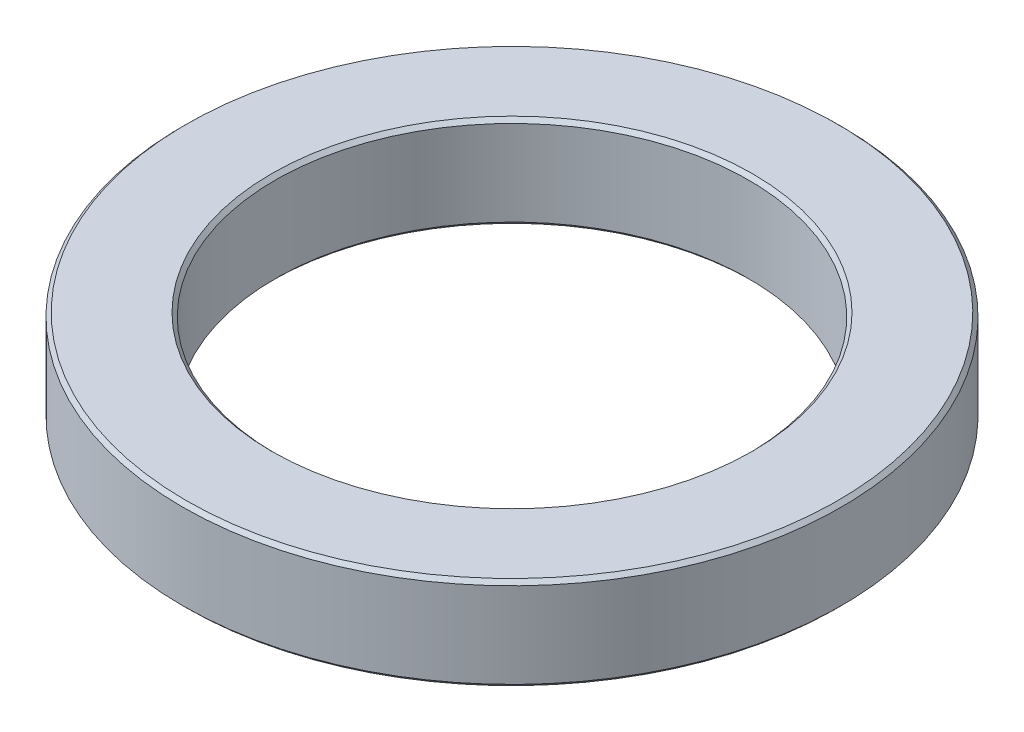
ISO-10303-21;
HEADER;
FILE_DESCRIPTION(('STEP AP214'),'2;1');
FILE_NAME('part.step','',(''),(''),'','','');
FILE_SCHEMA(('AUTOMOTIVE_DESIGN { 1 0 10303 214 1 1 1 1 }'));
ENDSEC;
DATA;
#1=APPLICATION_CONTEXT('core data for automotive mechanical design processes');
#2=APPLICATION_PROTOCOL_DEFINITION('international standard','automotive_design',2000,#1);
#3=PRODUCT_CONTEXT('',#1,'mechanical');
#4=PRODUCT('Part','Part','',(#3));
#5=PRODUCT_RELATED_PRODUCT_CATEGORY('part','',(#4));
#6=PRODUCT_DEFINITION_FORMATION('','',#4);
#7=PRODUCT_DEFINITION_CONTEXT('part definition',#1,'design');
#8=PRODUCT_DEFINITION('design','',#6,#7);
#9=PRODUCT_DEFINITION_SHAPE('','',#8);
#10=(LENGTH_UNIT() NAMED_UNIT(*) SI_UNIT(.MILLI.,.METRE.));
#11=(NAMED_UNIT(*) PLANE_ANGLE_UNIT() SI_UNIT($,.RADIAN.));
#12=(NAMED_UNIT(*) SI_UNIT($,.STERADIAN.) SOLID_ANGLE_UNIT());
#13=UNCERTAINTY_MEASURE_WITH_UNIT(LENGTH_MEASURE(1.E-05),#10,'distance_accuracy_value','');
#14=(GEOMETRIC_REPRESENTATION_CONTEXT(3) GLOBAL_UNCERTAINTY_ASSIGNED_CONTEXT((#13)) GLOBAL_UNIT_ASSIGNED_CONTEXT((#10,
#11,#12)) REPRESENTATION_CONTEXT('',''));
#15=CARTESIAN_POINT('',(0.,0.,0.));
#16=DIRECTION('',(0.,0.,1.));
#17=DIRECTION('',(1.,0.,0.));
#18=AXIS2_PLACEMENT_3D('',#15,#16,#17);
#19=CARTESIAN_POINT('',(0.,5.,0.));
#20=DIRECTION('',(0.,1.,0.));
#21=DIRECTION('',(0.,0.,1.));
#22=AXIS2_PLACEMENT_3D('',#19,#20,#21);
#23=PLANE('',#22);
#24=CARTESIAN_POINT('',(0.,5.,0.));
#25=DIRECTION('',(0.,1.,0.));
#26=DIRECTION('',(0.,0.,1.));
#27=AXIS2_PLACEMENT_3D('',#24,#25,#26);
#28=CIRCLE('',#27,12.95);
#29=CARTESIAN_POINT('',(0.,5.,12.95));
#30=VERTEX_POINT('',#29);
#31=EDGE_CURVE('E12',#30,#30,#28,.F.);
#32=ORIENTED_EDGE('',*,*,#31,.T.);
#33=EDGE_LOOP('',(#32));
#34=FACE_BOUND('',#33,.T.);
#35=CARTESIAN_POINT('',(0.,5.,0.));
#36=DIRECTION('',(0.,1.,0.));
#37=DIRECTION('',(0.,0.,1.));
#38=AXIS2_PLACEMENT_3D('',#35,#36,#37);
#39=CIRCLE('',#38,17.55);
#40=CARTESIAN_POINT('',(0.,5.,17.55));
#41=VERTEX_POINT('',#40);
#42=EDGE_CURVE('E53',#41,#41,#39,.T.);
#43=ORIENTED_EDGE('',*,*,#42,.T.);
#44=EDGE_LOOP('',(#43));
#45=FACE_BOUND('',#44,.T.);
#46=ADVANCED_FACE('F46',(#34,#45),#23,.T.);
#47=CARTESIAN_POINT('',(0.,0.,0.));
#48=DIRECTION('',(0.,1.,0.));
#49=DIRECTION('',(0.,0.,1.));
#50=AXIS2_PLACEMENT_3D('',#47,#48,#49);
#51=PLANE('',#50);
#52=CARTESIAN_POINT('',(0.,0.,0.));
#53=DIRECTION('',(0.,1.,0.));
#54=DIRECTION('',(0.,0.,1.));
#55=AXIS2_PLACEMENT_3D('',#52,#53,#54);
#56=CIRCLE('',#55,12.95);
#57=CARTESIAN_POINT('',(0.,0.,12.95));
#58=VERTEX_POINT('',#57);
#59=EDGE_CURVE('E72',#58,#58,#56,.T.);
#60=ORIENTED_EDGE('',*,*,#59,.T.);
#61=EDGE_LOOP('',(#60));
#62=FACE_BOUND('',#61,.T.);
#63=CARTESIAN_POINT('',(0.,0.,0.));
#64=DIRECTION('',(0.,1.,0.));
#65=DIRECTION('',(0.,0.,1.));
#66=AXIS2_PLACEMENT_3D('',#63,#64,#65);
#67=CIRCLE('',#66,17.55);
#68=CARTESIAN_POINT('',(0.,0.,17.55));
#69=VERTEX_POINT('',#68);
#70=EDGE_CURVE('E75',#69,#69,#67,.F.);
#71=ORIENTED_EDGE('',*,*,#70,.T.);
#72=EDGE_LOOP('',(#71));
#73=FACE_BOUND('',#72,.T.);
#74=ADVANCED_FACE('F79',(#62,#73),#51,.F.);
#75=CARTESIAN_POINT('',(0.,5.,0.));
#76=DIRECTION('',(0.,-1.,0.));
#77=DIRECTION('',(0.,0.,-1.));
#78=AXIS2_PLACEMENT_3D('',#75,#76,#77);
#79=CYLINDRICAL_SURFACE('',#78,17.75);
#80=CARTESIAN_POINT('',(0.,0.199999999999999,0.));
#81=DIRECTION('',(0.,1.,0.));
#82=DIRECTION('',(0.,0.,1.));
#83=AXIS2_PLACEMENT_3D('',#80,#81,#82);
#84=CIRCLE('',#83,17.75);
#85=CARTESIAN_POINT('',(0.,0.199999999999999,17.75));
#86=VERTEX_POINT('',#85);
#87=EDGE_CURVE('E57',#86,#86,#84,.T.);
#88=ORIENTED_EDGE('',*,*,#87,.T.);
#89=EDGE_LOOP('',(#88));
#90=FACE_BOUND('',#89,.T.);
#91=CARTESIAN_POINT('',(0.,4.80000000000001,0.));
#92=DIRECTION('',(0.,1.,0.));
#93=DIRECTION('',(0.,0.,1.));
#94=AXIS2_PLACEMENT_3D('',#91,#92,#93);
#95=CIRCLE('',#94,17.75);
#96=CARTESIAN_POINT('',(0.,4.80000000000001,17.75));
#97=VERTEX_POINT('',#96);
#98=EDGE_CURVE('E61',#97,#97,#95,.F.);
#99=ORIENTED_EDGE('',*,*,#98,.T.);
#100=EDGE_LOOP('',(#99));
#101=FACE_BOUND('',#100,.T.);
#102=ADVANCED_FACE('F89',(#90,#101),#79,.T.);
#103=CARTESIAN_POINT('',(0.,5.,0.));
#104=DIRECTION('',(0.,-1.,0.));
#105=DIRECTION('',(0.,0.,-1.));
#106=AXIS2_PLACEMENT_3D('',#103,#104,#105);
#107=CYLINDRICAL_SURFACE('',#106,12.75);
#108=CARTESIAN_POINT('',(0.,0.199999999999999,0.));
#109=DIRECTION('',(0.,1.,0.));
#110=DIRECTION('',(0.,0.,1.));
#111=AXIS2_PLACEMENT_3D('',#108,#109,#110);
#112=CIRCLE('',#111,12.75);
#113=CARTESIAN_POINT('',(0.,0.199999999999999,12.75));
#114=VERTEX_POINT('',#113);
#115=EDGE_CURVE('E66',#114,#114,#112,.F.);
#116=ORIENTED_EDGE('',*,*,#115,.T.);
#117=EDGE_LOOP('',(#116));
#118=FACE_BOUND('',#117,.T.);
#119=CARTESIAN_POINT('',(0.,4.8,0.));
#120=DIRECTION('',(0.,1.,0.));
#121=DIRECTION('',(0.,0.,1.));
#122=AXIS2_PLACEMENT_3D('',#119,#120,#121);
#123=CIRCLE('',#122,12.75);
#124=CARTESIAN_POINT('',(0.,4.8,12.75));
#125=VERTEX_POINT('',#124);
#126=EDGE_CURVE('E69',#125,#125,#123,.T.);
#127=ORIENTED_EDGE('',*,*,#126,.T.);
#128=EDGE_LOOP('',(#127));
#129=FACE_BOUND('',#128,.T.);
#130=ADVANCED_FACE('F92',(#118,#129),#107,.F.);
#131=CARTESIAN_POINT('',(0.,0.,0.));
#132=DIRECTION('',(0.,-1.,0.));
#133=DIRECTION('',(0.,0.,-1.));
#134=AXIS2_PLACEMENT_3D('',#131,#132,#133);
#135=CONICAL_SURFACE('',#134,12.95,0.785398163397453);
#136=ORIENTED_EDGE('',*,*,#115,.F.);
#137=EDGE_LOOP('',(#136));
#138=FACE_BOUND('',#137,.T.);
#139=ORIENTED_EDGE('',*,*,#59,.F.);
#140=EDGE_LOOP('',(#139));
#141=FACE_BOUND('',#140,.T.);
#142=ADVANCED_FACE('F85',(#138,#141),#135,.F.);
#143=CARTESIAN_POINT('',(0.,0.199999999999999,0.));
#144=DIRECTION('',(0.,1.,0.));
#145=DIRECTION('',(0.,0.,1.));
#146=AXIS2_PLACEMENT_3D('',#143,#144,#145);
#147=CONICAL_SURFACE('',#146,17.75,0.785398163397466);
#148=ORIENTED_EDGE('',*,*,#70,.F.);
#149=EDGE_LOOP('',(#148));
#150=FACE_BOUND('',#149,.T.);
#151=ORIENTED_EDGE('',*,*,#87,.F.);
#152=EDGE_LOOP('',(#151));
#153=FACE_BOUND('',#152,.T.);
#154=ADVANCED_FACE('F81',(#150,#153),#147,.T.);
#155=CARTESIAN_POINT('',(0.,4.8,0.));
#156=DIRECTION('',(0.,1.,0.));
#157=DIRECTION('',(0.,0.,1.));
#158=AXIS2_PLACEMENT_3D('',#155,#156,#157);
#159=CONICAL_SURFACE('',#158,12.75,0.785398163397435);
#160=ORIENTED_EDGE('',*,*,#31,.F.);
#161=EDGE_LOOP('',(#160));
#162=FACE_BOUND('',#161,.T.);
#163=ORIENTED_EDGE('',*,*,#126,.F.);
#164=EDGE_LOOP('',(#163));
#165=FACE_BOUND('',#164,.T.);
#166=ADVANCED_FACE('F84',(#162,#165),#159,.F.);
#167=CARTESIAN_POINT('',(0.,5.,0.));
#168=DIRECTION('',(0.,-1.,0.));
#169=DIRECTION('',(0.,0.,-1.));
#170=AXIS2_PLACEMENT_3D('',#167,#168,#169);
#171=CONICAL_SURFACE('',#170,17.55,0.785398163397448);
#172=ORIENTED_EDGE('',*,*,#98,.F.);
#173=EDGE_LOOP('',(#172));
#174=FACE_BOUND('',#173,.T.);
#175=ORIENTED_EDGE('',*,*,#42,.F.);
#176=EDGE_LOOP('',(#175));
#177=FACE_BOUND('',#176,.T.);
#178=ADVANCED_FACE('F48',(#174,#177),#171,.T.);
#179=CLOSED_SHELL('',(#46,#74,#102,#130,#142,#154,#166,#178));
#180=MANIFOLD_SOLID_BREP('B2',#179);
#181=ADVANCED_BREP_SHAPE_REPRESENTATION('',(#18,#180),#14);
#182=SHAPE_DEFINITION_REPRESENTATION(#9,#181);
ENDSEC;
END-ISO-10303-21;
